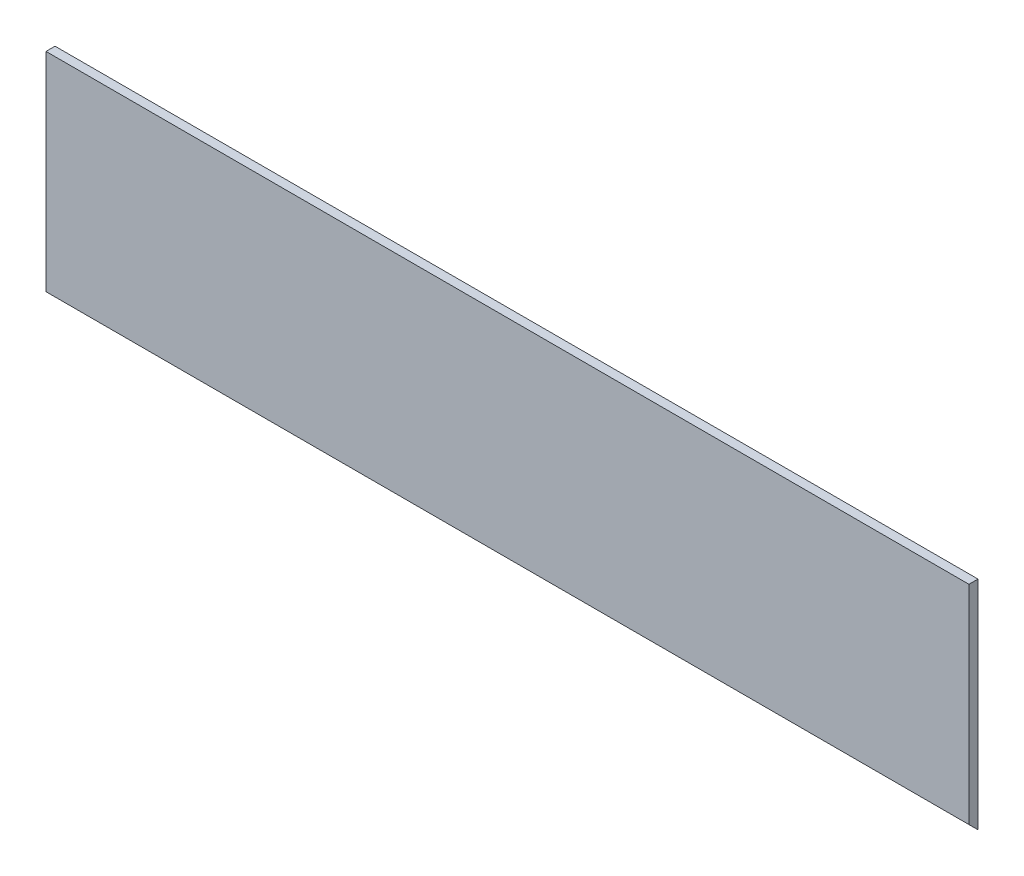
ISO-10303-21;
HEADER;
FILE_DESCRIPTION(('STEP AP214'),'2;1');
FILE_NAME('part.step','',(''),(''),'','','');
FILE_SCHEMA(('AUTOMOTIVE_DESIGN { 1 0 10303 214 1 1 1 1 }'));
ENDSEC;
DATA;
#1=APPLICATION_CONTEXT('core data for automotive mechanical design processes');
#2=APPLICATION_PROTOCOL_DEFINITION('international standard','automotive_design',2000,#1);
#3=PRODUCT_CONTEXT('',#1,'mechanical');
#4=PRODUCT('Part','Part','',(#3));
#5=PRODUCT_RELATED_PRODUCT_CATEGORY('part','',(#4));
#6=PRODUCT_DEFINITION_FORMATION('','',#4);
#7=PRODUCT_DEFINITION_CONTEXT('part definition',#1,'design');
#8=PRODUCT_DEFINITION('design','',#6,#7);
#9=PRODUCT_DEFINITION_SHAPE('','',#8);
#10=(LENGTH_UNIT() NAMED_UNIT(*) SI_UNIT(.MILLI.,.METRE.));
#11=(NAMED_UNIT(*) PLANE_ANGLE_UNIT() SI_UNIT($,.RADIAN.));
#12=(NAMED_UNIT(*) SI_UNIT($,.STERADIAN.) SOLID_ANGLE_UNIT());
#13=UNCERTAINTY_MEASURE_WITH_UNIT(LENGTH_MEASURE(1.E-05),#10,'distance_accuracy_value','');
#14=(GEOMETRIC_REPRESENTATION_CONTEXT(3) GLOBAL_UNCERTAINTY_ASSIGNED_CONTEXT((#13)) GLOBAL_UNIT_ASSIGNED_CONTEXT((#10,
#11,#12)) REPRESENTATION_CONTEXT('',''));
#15=CARTESIAN_POINT('',(0.,0.,0.));
#16=DIRECTION('',(0.,0.,1.));
#17=DIRECTION('',(1.,0.,0.));
#18=AXIS2_PLACEMENT_3D('',#15,#16,#17);
#19=CARTESIAN_POINT('',(-102.,-24.,2.));
#20=DIRECTION('',(1.,0.,0.));
#21=DIRECTION('',(0.,0.,-1.));
#22=AXIS2_PLACEMENT_3D('',#19,#20,#21);
#23=PLANE('',#22);
#24=DIRECTION('',(0.,-1.,0.));
#25=VECTOR('',#24,1.);
#26=CARTESIAN_POINT('',(-102.,-24.,0.));
#27=LINE('',#26,#25);
#28=CARTESIAN_POINT('',(-102.,24.,0.));
#29=VERTEX_POINT('',#28);
#30=CARTESIAN_POINT('',(-102.,-24.,0.));
#31=VERTEX_POINT('',#30);
#32=EDGE_CURVE('E80',#29,#31,#27,.T.);
#33=ORIENTED_EDGE('',*,*,#32,.T.);
#34=DIRECTION('',(0.,0.707106781186547,0.707106781186548));
#35=VECTOR('',#34,1.);
#36=CARTESIAN_POINT('',(-102.,-23.,0.99999999999999));
#37=LINE('',#36,#35);
#38=CARTESIAN_POINT('',(-102.,-22.,2.));
#39=VERTEX_POINT('',#38);
#40=EDGE_CURVE('E85',#31,#39,#37,.T.);
#41=ORIENTED_EDGE('',*,*,#40,.T.);
#42=DIRECTION('',(0.,-1.,0.));
#43=VECTOR('',#42,1.);
#44=CARTESIAN_POINT('',(-102.,-24.,2.));
#45=LINE('',#44,#43);
#46=CARTESIAN_POINT('',(-102.,24.,2.));
#47=VERTEX_POINT('',#46);
#48=EDGE_CURVE('E75',#47,#39,#45,.T.);
#49=ORIENTED_EDGE('',*,*,#48,.F.);
#50=DIRECTION('',(0.,0.,-1.));
#51=VECTOR('',#50,1.);
#52=CARTESIAN_POINT('',(-102.,24.,2.));
#53=LINE('',#52,#51);
#54=EDGE_CURVE('E43',#47,#29,#53,.T.);
#55=ORIENTED_EDGE('',*,*,#54,.T.);
#56=EDGE_LOOP('',(#33,#41,#49,#55));
#57=FACE_BOUND('',#56,.T.);
#58=ADVANCED_FACE('F35',(#57),#23,.F.);
#59=CARTESIAN_POINT('',(102.,-24.,2.));
#60=DIRECTION('',(-1.,0.,0.));
#61=DIRECTION('',(0.,0.,1.));
#62=AXIS2_PLACEMENT_3D('',#59,#60,#61);
#63=PLANE('',#62);
#64=DIRECTION('',(0.,1.,0.));
#65=VECTOR('',#64,1.);
#66=CARTESIAN_POINT('',(102.,-24.,2.));
#67=LINE('',#66,#65);
#68=CARTESIAN_POINT('',(102.,-22.,2.));
#69=VERTEX_POINT('',#68);
#70=CARTESIAN_POINT('',(102.,24.,2.));
#71=VERTEX_POINT('',#70);
#72=EDGE_CURVE('E93',#69,#71,#67,.T.);
#73=ORIENTED_EDGE('',*,*,#72,.F.);
#74=DIRECTION('',(0.,0.707106781186547,0.707106781186548));
#75=VECTOR('',#74,1.);
#76=CARTESIAN_POINT('',(102.,-22.,2.));
#77=LINE('',#76,#75);
#78=CARTESIAN_POINT('',(102.,-24.,0.));
#79=VERTEX_POINT('',#78);
#80=EDGE_CURVE('E98',#79,#69,#77,.T.);
#81=ORIENTED_EDGE('',*,*,#80,.F.);
#82=DIRECTION('',(0.,1.,0.));
#83=VECTOR('',#82,1.);
#84=CARTESIAN_POINT('',(102.,-24.,0.));
#85=LINE('',#84,#83);
#86=CARTESIAN_POINT('',(102.,24.,0.));
#87=VERTEX_POINT('',#86);
#88=EDGE_CURVE('E65',#79,#87,#85,.T.);
#89=ORIENTED_EDGE('',*,*,#88,.T.);
#90=DIRECTION('',(0.,0.,-1.));
#91=VECTOR('',#90,1.);
#92=CARTESIAN_POINT('',(102.,24.,2.));
#93=LINE('',#92,#91);
#94=EDGE_CURVE('E11',#71,#87,#93,.T.);
#95=ORIENTED_EDGE('',*,*,#94,.F.);
#96=EDGE_LOOP('',(#73,#81,#89,#95));
#97=FACE_BOUND('',#96,.T.);
#98=ADVANCED_FACE('F108',(#97),#63,.F.);
#99=CARTESIAN_POINT('',(102.,24.,2.));
#100=DIRECTION('',(0.,-1.,0.));
#101=DIRECTION('',(1.,0.,0.));
#102=AXIS2_PLACEMENT_3D('',#99,#100,#101);
#103=PLANE('',#102);
#104=DIRECTION('',(-1.,0.,0.));
#105=VECTOR('',#104,1.);
#106=CARTESIAN_POINT('',(102.,24.,0.));
#107=LINE('',#106,#105);
#108=EDGE_CURVE('E69',#87,#29,#107,.T.);
#109=ORIENTED_EDGE('',*,*,#108,.T.);
#110=ORIENTED_EDGE('',*,*,#54,.F.);
#111=DIRECTION('',(-1.,0.,0.));
#112=VECTOR('',#111,1.);
#113=CARTESIAN_POINT('',(102.,24.,2.));
#114=LINE('',#113,#112);
#115=EDGE_CURVE('E51',#71,#47,#114,.T.);
#116=ORIENTED_EDGE('',*,*,#115,.F.);
#117=ORIENTED_EDGE('',*,*,#94,.T.);
#118=EDGE_LOOP('',(#109,#110,#116,#117));
#119=FACE_BOUND('',#118,.T.);
#120=ADVANCED_FACE('F71',(#119),#103,.F.);
#121=CARTESIAN_POINT('',(0.,0.,2.));
#122=DIRECTION('',(0.,0.,1.));
#123=DIRECTION('',(1.,0.,0.));
#124=AXIS2_PLACEMENT_3D('',#121,#122,#123);
#125=PLANE('',#124);
#126=DIRECTION('',(1.,0.,0.));
#127=VECTOR('',#126,1.);
#128=CARTESIAN_POINT('',(-182.,-22.,2.));
#129=LINE('',#128,#127);
#130=EDGE_CURVE('E88',#39,#69,#129,.T.);
#131=ORIENTED_EDGE('',*,*,#130,.T.);
#132=ORIENTED_EDGE('',*,*,#72,.T.);
#133=ORIENTED_EDGE('',*,*,#115,.T.);
#134=ORIENTED_EDGE('',*,*,#48,.T.);
#135=EDGE_LOOP('',(#131,#132,#133,#134));
#136=FACE_BOUND('',#135,.T.);
#137=ADVANCED_FACE('F107',(#136),#125,.T.);
#138=CARTESIAN_POINT('',(0.,0.,0.));
#139=DIRECTION('',(0.,0.,1.));
#140=DIRECTION('',(1.,0.,0.));
#141=AXIS2_PLACEMENT_3D('',#138,#139,#140);
#142=PLANE('',#141);
#143=ORIENTED_EDGE('',*,*,#32,.F.);
#144=ORIENTED_EDGE('',*,*,#108,.F.);
#145=ORIENTED_EDGE('',*,*,#88,.F.);
#146=DIRECTION('',(1.,0.,0.));
#147=VECTOR('',#146,1.);
#148=CARTESIAN_POINT('',(102.,-24.,0.));
#149=LINE('',#148,#147);
#150=EDGE_CURVE('E84',#31,#79,#149,.T.);
#151=ORIENTED_EDGE('',*,*,#150,.F.);
#152=EDGE_LOOP('',(#143,#144,#145,#151));
#153=FACE_BOUND('',#152,.T.);
#154=ADVANCED_FACE('F82',(#153),#142,.F.);
#155=CARTESIAN_POINT('',(-182.,-22.,2.));
#156=DIRECTION('',(0.,0.707106781186548,-0.707106781186547));
#157=DIRECTION('',(0.,0.707106781186547,0.707106781186548));
#158=AXIS2_PLACEMENT_3D('',#155,#156,#157);
#159=PLANE('',#158);
#160=ORIENTED_EDGE('',*,*,#150,.T.);
#161=ORIENTED_EDGE('',*,*,#80,.T.);
#162=ORIENTED_EDGE('',*,*,#130,.F.);
#163=ORIENTED_EDGE('',*,*,#40,.F.);
#164=EDGE_LOOP('',(#160,#161,#162,#163));
#165=FACE_BOUND('',#164,.T.);
#166=ADVANCED_FACE('F103',(#165),#159,.F.);
#167=CLOSED_SHELL('',(#58,#98,#120,#137,#154,#166));
#168=MANIFOLD_SOLID_BREP('B2',#167);
#169=ADVANCED_BREP_SHAPE_REPRESENTATION('',(#18,#168),#14);
#170=SHAPE_DEFINITION_REPRESENTATION(#9,#169);
ENDSEC;
END-ISO-10303-21;
